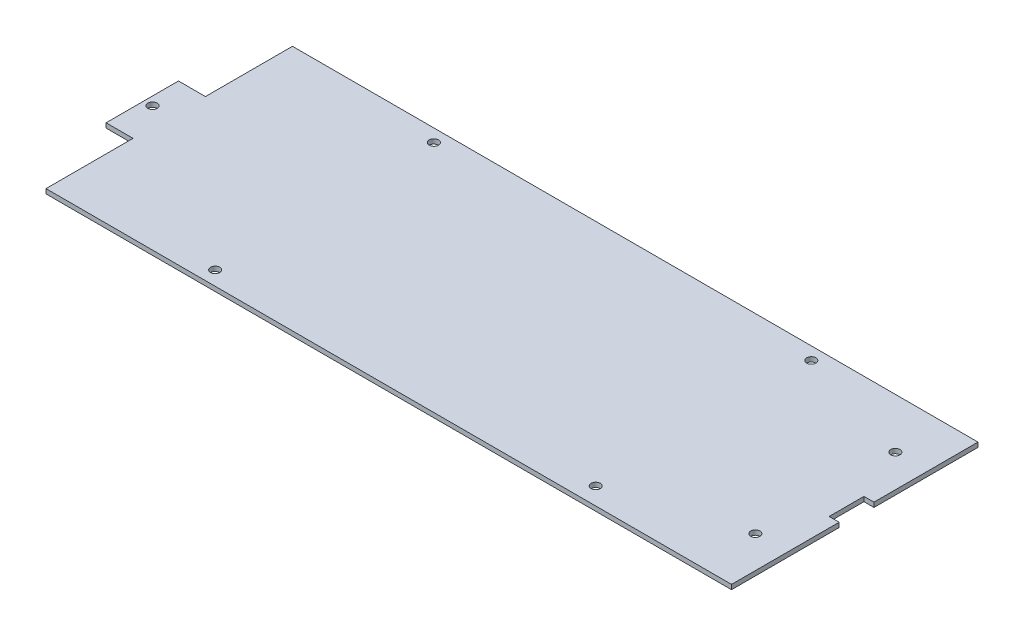
ISO-10303-21;
HEADER;
FILE_DESCRIPTION(('STEP AP214'),'2;1');
FILE_NAME('part.step','',(''),(''),'','','');
FILE_SCHEMA(('AUTOMOTIVE_DESIGN { 1 0 10303 214 1 1 1 1 }'));
ENDSEC;
DATA;
#1=APPLICATION_CONTEXT('core data for automotive mechanical design processes');
#2=APPLICATION_PROTOCOL_DEFINITION('international standard','automotive_design',2000,#1);
#3=PRODUCT_CONTEXT('',#1,'mechanical');
#4=PRODUCT('Part','Part','',(#3));
#5=PRODUCT_RELATED_PRODUCT_CATEGORY('part','',(#4));
#6=PRODUCT_DEFINITION_FORMATION('','',#4);
#7=PRODUCT_DEFINITION_CONTEXT('part definition',#1,'design');
#8=PRODUCT_DEFINITION('design','',#6,#7);
#9=PRODUCT_DEFINITION_SHAPE('','',#8);
#10=(LENGTH_UNIT() NAMED_UNIT(*) SI_UNIT(.MILLI.,.METRE.));
#11=(NAMED_UNIT(*) PLANE_ANGLE_UNIT() SI_UNIT($,.RADIAN.));
#12=(NAMED_UNIT(*) SI_UNIT($,.STERADIAN.) SOLID_ANGLE_UNIT());
#13=UNCERTAINTY_MEASURE_WITH_UNIT(LENGTH_MEASURE(1.E-05),#10,'distance_accuracy_value','');
#14=(GEOMETRIC_REPRESENTATION_CONTEXT(3) GLOBAL_UNCERTAINTY_ASSIGNED_CONTEXT((#13)) GLOBAL_UNIT_ASSIGNED_CONTEXT((#10,
#11,#12)) REPRESENTATION_CONTEXT('',''));
#15=CARTESIAN_POINT('',(0.,0.,0.));
#16=DIRECTION('',(0.,0.,1.));
#17=DIRECTION('',(1.,0.,0.));
#18=AXIS2_PLACEMENT_3D('',#15,#16,#17);
#19=CARTESIAN_POINT('',(2.14373577133293E-13,5.,859.252958265063));
#20=DIRECTION('',(0.,0.,1.));
#21=DIRECTION('',(1.,0.,0.));
#22=AXIS2_PLACEMENT_3D('',#19,#20,#21);
#23=PLANE('',#22);
#24=DIRECTION('',(-1.,0.,0.));
#25=VECTOR('',#24,1.);
#26=CARTESIAN_POINT('',(2.14373577133293E-13,2.,859.252958265063));
#27=LINE('',#26,#25);
#28=CARTESIAN_POINT('',(160.264471064903,2.,859.252958265063));
#29=VERTEX_POINT('',#28);
#30=CARTESIAN_POINT('',(-284.735528935097,2.,859.252958265063));
#31=VERTEX_POINT('',#30);
#32=EDGE_CURVE('E197',#29,#31,#27,.T.);
#33=ORIENTED_EDGE('',*,*,#32,.F.);
#34=DIRECTION('',(0.,-1.,0.));
#35=VECTOR('',#34,1.);
#36=CARTESIAN_POINT('',(160.264471064903,5.,859.252958265063));
#37=LINE('',#36,#35);
#38=CARTESIAN_POINT('',(160.264471064903,5.,859.252958265063));
#39=VERTEX_POINT('',#38);
#40=EDGE_CURVE('E11',#39,#29,#37,.T.);
#41=ORIENTED_EDGE('',*,*,#40,.F.);
#42=DIRECTION('',(-1.,0.,0.));
#43=VECTOR('',#42,1.);
#44=CARTESIAN_POINT('',(2.14373577133293E-13,5.,859.252958265063));
#45=LINE('',#44,#43);
#46=CARTESIAN_POINT('',(-284.735528935097,5.,859.252958265063));
#47=VERTEX_POINT('',#46);
#48=EDGE_CURVE('E542',#39,#47,#45,.T.);
#49=ORIENTED_EDGE('',*,*,#48,.T.);
#50=DIRECTION('',(0.,-1.,0.));
#51=VECTOR('',#50,1.);
#52=CARTESIAN_POINT('',(-284.735528935097,5.,859.252958265063));
#53=LINE('',#52,#51);
#54=EDGE_CURVE('E112',#47,#31,#53,.T.);
#55=ORIENTED_EDGE('',*,*,#54,.T.);
#56=EDGE_LOOP('',(#33,#41,#49,#55));
#57=FACE_BOUND('',#56,.T.);
#58=ADVANCED_FACE('F49',(#57),#23,.T.);
#59=CARTESIAN_POINT('',(160.264471064903,5.,0.));
#60=DIRECTION('',(1.,0.,0.));
#61=DIRECTION('',(0.,0.,-1.));
#62=AXIS2_PLACEMENT_3D('',#59,#60,#61);
#63=PLANE('',#62);
#64=DIRECTION('',(0.,0.,1.));
#65=VECTOR('',#64,1.);
#66=CARTESIAN_POINT('',(160.264471064903,2.,0.));
#67=LINE('',#66,#65);
#68=CARTESIAN_POINT('',(160.264471064903,2.,789.390866852255));
#69=VERTEX_POINT('',#68);
#70=EDGE_CURVE('E195',#69,#29,#67,.T.);
#71=ORIENTED_EDGE('',*,*,#70,.F.);
#72=DIRECTION('',(0.,-1.,0.));
#73=VECTOR('',#72,1.);
#74=CARTESIAN_POINT('',(160.264471064903,5.,789.390866852255));
#75=LINE('',#74,#73);
#76=CARTESIAN_POINT('',(160.264471064903,5.,789.390866852255));
#77=VERTEX_POINT('',#76);
#78=EDGE_CURVE('E58',#77,#69,#75,.T.);
#79=ORIENTED_EDGE('',*,*,#78,.F.);
#80=DIRECTION('',(0.,0.,1.));
#81=VECTOR('',#80,1.);
#82=CARTESIAN_POINT('',(160.264471064903,5.,0.));
#83=LINE('',#82,#81);
#84=EDGE_CURVE('E540',#77,#39,#83,.T.);
#85=ORIENTED_EDGE('',*,*,#84,.T.);
#86=ORIENTED_EDGE('',*,*,#40,.T.);
#87=EDGE_LOOP('',(#71,#79,#85,#86));
#88=FACE_BOUND('',#87,.T.);
#89=ADVANCED_FACE('F196',(#88),#63,.T.);
#90=CARTESIAN_POINT('',(0.,5.,789.390866852255));
#91=DIRECTION('',(0.,0.,-1.));
#92=DIRECTION('',(-1.,0.,0.));
#93=AXIS2_PLACEMENT_3D('',#90,#91,#92);
#94=PLANE('',#93);
#95=DIRECTION('',(1.,0.,0.));
#96=VECTOR('',#95,1.);
#97=CARTESIAN_POINT('',(0.,2.,789.390866852255));
#98=LINE('',#97,#96);
#99=CARTESIAN_POINT('',(153.764471064903,2.,789.390866852255));
#100=VERTEX_POINT('',#99);
#101=EDGE_CURVE('E187',#100,#69,#98,.T.);
#102=ORIENTED_EDGE('',*,*,#101,.F.);
#103=DIRECTION('',(0.,-1.,0.));
#104=VECTOR('',#103,1.);
#105=CARTESIAN_POINT('',(153.764471064903,5.,789.390866852255));
#106=LINE('',#105,#104);
#107=CARTESIAN_POINT('',(153.764471064903,5.,789.390866852255));
#108=VERTEX_POINT('',#107);
#109=EDGE_CURVE('E180',#108,#100,#106,.T.);
#110=ORIENTED_EDGE('',*,*,#109,.F.);
#111=DIRECTION('',(1.,0.,0.));
#112=VECTOR('',#111,1.);
#113=CARTESIAN_POINT('',(0.,5.,789.390866852255));
#114=LINE('',#113,#112);
#115=EDGE_CURVE('E190',#108,#77,#114,.T.);
#116=ORIENTED_EDGE('',*,*,#115,.T.);
#117=ORIENTED_EDGE('',*,*,#78,.T.);
#118=EDGE_LOOP('',(#102,#110,#116,#117));
#119=FACE_BOUND('',#118,.T.);
#120=ADVANCED_FACE('F185',(#119),#94,.T.);
#121=CARTESIAN_POINT('',(153.764471064903,5.,0.));
#122=DIRECTION('',(1.,0.,0.));
#123=DIRECTION('',(0.,0.,-1.));
#124=AXIS2_PLACEMENT_3D('',#121,#122,#123);
#125=PLANE('',#124);
#126=DIRECTION('',(0.,0.,1.));
#127=VECTOR('',#126,1.);
#128=CARTESIAN_POINT('',(153.764471064903,2.,0.));
#129=LINE('',#128,#127);
#130=CARTESIAN_POINT('',(153.764471064903,2.,766.790866852254));
#131=VERTEX_POINT('',#130);
#132=EDGE_CURVE('E203',#131,#100,#129,.T.);
#133=ORIENTED_EDGE('',*,*,#132,.F.);
#134=DIRECTION('',(0.,-1.,0.));
#135=VECTOR('',#134,1.);
#136=CARTESIAN_POINT('',(153.764471064903,5.,766.790866852254));
#137=LINE('',#136,#135);
#138=CARTESIAN_POINT('',(153.764471064903,5.,766.790866852254));
#139=VERTEX_POINT('',#138);
#140=EDGE_CURVE('E178',#139,#131,#137,.T.);
#141=ORIENTED_EDGE('',*,*,#140,.F.);
#142=DIRECTION('',(0.,0.,1.));
#143=VECTOR('',#142,1.);
#144=CARTESIAN_POINT('',(153.764471064903,5.,0.));
#145=LINE('',#144,#143);
#146=EDGE_CURVE('E493',#139,#108,#145,.T.);
#147=ORIENTED_EDGE('',*,*,#146,.T.);
#148=ORIENTED_EDGE('',*,*,#109,.T.);
#149=EDGE_LOOP('',(#133,#141,#147,#148));
#150=FACE_BOUND('',#149,.T.);
#151=ADVANCED_FACE('F333',(#150),#125,.T.);
#152=CARTESIAN_POINT('',(0.,5.,766.790866852254));
#153=DIRECTION('',(0.,0.,1.));
#154=DIRECTION('',(1.,0.,0.));
#155=AXIS2_PLACEMENT_3D('',#152,#153,#154);
#156=PLANE('',#155);
#157=DIRECTION('',(-1.,0.,0.));
#158=VECTOR('',#157,1.);
#159=CARTESIAN_POINT('',(0.,2.,766.790866852254));
#160=LINE('',#159,#158);
#161=CARTESIAN_POINT('',(160.264471064903,2.,766.790866852254));
#162=VERTEX_POINT('',#161);
#163=EDGE_CURVE('E205',#162,#131,#160,.T.);
#164=ORIENTED_EDGE('',*,*,#163,.F.);
#165=DIRECTION('',(0.,-1.,0.));
#166=VECTOR('',#165,1.);
#167=CARTESIAN_POINT('',(160.264471064903,5.,766.790866852254));
#168=LINE('',#167,#166);
#169=CARTESIAN_POINT('',(160.264471064903,5.,766.790866852254));
#170=VERTEX_POINT('',#169);
#171=EDGE_CURVE('E176',#170,#162,#168,.T.);
#172=ORIENTED_EDGE('',*,*,#171,.F.);
#173=DIRECTION('',(-1.,0.,0.));
#174=VECTOR('',#173,1.);
#175=CARTESIAN_POINT('',(0.,5.,766.790866852254));
#176=LINE('',#175,#174);
#177=EDGE_CURVE('E489',#170,#139,#176,.T.);
#178=ORIENTED_EDGE('',*,*,#177,.T.);
#179=ORIENTED_EDGE('',*,*,#140,.T.);
#180=EDGE_LOOP('',(#164,#172,#178,#179));
#181=FACE_BOUND('',#180,.T.);
#182=ADVANCED_FACE('F329',(#181),#156,.T.);
#183=CARTESIAN_POINT('',(160.264471064903,5.,0.));
#184=DIRECTION('',(1.,0.,0.));
#185=DIRECTION('',(0.,0.,-1.));
#186=AXIS2_PLACEMENT_3D('',#183,#184,#185);
#187=PLANE('',#186);
#188=DIRECTION('',(0.,0.,1.));
#189=VECTOR('',#188,1.);
#190=CARTESIAN_POINT('',(160.264471064903,2.,0.));
#191=LINE('',#190,#189);
#192=CARTESIAN_POINT('',(160.264471064903,2.,699.252958265063));
#193=VERTEX_POINT('',#192);
#194=EDGE_CURVE('E210',#193,#162,#191,.T.);
#195=ORIENTED_EDGE('',*,*,#194,.F.);
#196=DIRECTION('',(0.,-1.,0.));
#197=VECTOR('',#196,1.);
#198=CARTESIAN_POINT('',(160.264471064903,5.,699.252958265063));
#199=LINE('',#198,#197);
#200=CARTESIAN_POINT('',(160.264471064903,5.,699.252958265063));
#201=VERTEX_POINT('',#200);
#202=EDGE_CURVE('E174',#201,#193,#199,.T.);
#203=ORIENTED_EDGE('',*,*,#202,.F.);
#204=DIRECTION('',(0.,0.,1.));
#205=VECTOR('',#204,1.);
#206=CARTESIAN_POINT('',(160.264471064903,5.,0.));
#207=LINE('',#206,#205);
#208=EDGE_CURVE('E492',#201,#170,#207,.T.);
#209=ORIENTED_EDGE('',*,*,#208,.T.);
#210=ORIENTED_EDGE('',*,*,#171,.T.);
#211=EDGE_LOOP('',(#195,#203,#209,#210));
#212=FACE_BOUND('',#211,.T.);
#213=ADVANCED_FACE('F325',(#212),#187,.T.);
#214=CARTESIAN_POINT('',(-1.74455445910815E-13,5.,699.252958265063));
#215=DIRECTION('',(0.,0.,-1.));
#216=DIRECTION('',(-1.,0.,0.));
#217=AXIS2_PLACEMENT_3D('',#214,#215,#216);
#218=PLANE('',#217);
#219=DIRECTION('',(1.,0.,0.));
#220=VECTOR('',#219,1.);
#221=CARTESIAN_POINT('',(-1.74455445910815E-13,2.,699.252958265063));
#222=LINE('',#221,#220);
#223=CARTESIAN_POINT('',(-284.735528935097,2.,699.252958265063));
#224=VERTEX_POINT('',#223);
#225=EDGE_CURVE('E213',#224,#193,#222,.T.);
#226=ORIENTED_EDGE('',*,*,#225,.F.);
#227=DIRECTION('',(0.,-1.,0.));
#228=VECTOR('',#227,1.);
#229=CARTESIAN_POINT('',(-284.735528935097,5.,699.252958265063));
#230=LINE('',#229,#228);
#231=CARTESIAN_POINT('',(-284.735528935097,5.,699.252958265063));
#232=VERTEX_POINT('',#231);
#233=EDGE_CURVE('E172',#232,#224,#230,.T.);
#234=ORIENTED_EDGE('',*,*,#233,.F.);
#235=DIRECTION('',(1.,0.,0.));
#236=VECTOR('',#235,1.);
#237=CARTESIAN_POINT('',(-1.74455445910815E-13,5.,699.252958265063));
#238=LINE('',#237,#236);
#239=EDGE_CURVE('E495',#232,#201,#238,.T.);
#240=ORIENTED_EDGE('',*,*,#239,.T.);
#241=ORIENTED_EDGE('',*,*,#202,.T.);
#242=EDGE_LOOP('',(#226,#234,#240,#241));
#243=FACE_BOUND('',#242,.T.);
#244=ADVANCED_FACE('F321',(#243),#218,.T.);
#245=CARTESIAN_POINT('',(-284.735528935097,5.,2.79752159427051E-13));
#246=DIRECTION('',(1.,0.,0.));
#247=DIRECTION('',(0.,0.,-1.));
#248=AXIS2_PLACEMENT_3D('',#245,#246,#247);
#249=PLANE('',#248);
#250=DIRECTION('',(0.,0.,1.));
#251=VECTOR('',#250,1.);
#252=CARTESIAN_POINT('',(-284.735528935097,2.,2.79752159427051E-13));
#253=LINE('',#252,#251);
#254=CARTESIAN_POINT('',(-284.735528935097,2.,755.752958265063));
#255=VERTEX_POINT('',#254);
#256=EDGE_CURVE('E216',#224,#255,#253,.T.);
#257=ORIENTED_EDGE('',*,*,#256,.T.);
#258=DIRECTION('',(0.,-1.,0.));
#259=VECTOR('',#258,1.);
#260=CARTESIAN_POINT('',(-284.735528935097,5.,755.752958265063));
#261=LINE('',#260,#259);
#262=CARTESIAN_POINT('',(-284.735528935097,5.,755.752958265063));
#263=VERTEX_POINT('',#262);
#264=EDGE_CURVE('E166',#263,#255,#261,.T.);
#265=ORIENTED_EDGE('',*,*,#264,.F.);
#266=DIRECTION('',(0.,0.,1.));
#267=VECTOR('',#266,1.);
#268=CARTESIAN_POINT('',(-284.735528935097,5.,2.79752159427051E-13));
#269=LINE('',#268,#267);
#270=EDGE_CURVE('E502',#232,#263,#269,.T.);
#271=ORIENTED_EDGE('',*,*,#270,.F.);
#272=ORIENTED_EDGE('',*,*,#233,.T.);
#273=EDGE_LOOP('',(#257,#265,#271,#272));
#274=FACE_BOUND('',#273,.T.);
#275=ADVANCED_FACE('F317',(#274),#249,.F.);
#276=CARTESIAN_POINT('',(0.,5.,755.752958265063));
#277=DIRECTION('',(0.,0.,-1.));
#278=DIRECTION('',(-1.,0.,0.));
#279=AXIS2_PLACEMENT_3D('',#276,#277,#278);
#280=PLANE('',#279);
#281=DIRECTION('',(1.,0.,0.));
#282=VECTOR('',#281,1.);
#283=CARTESIAN_POINT('',(0.,2.,755.752958265063));
#284=LINE('',#283,#282);
#285=CARTESIAN_POINT('',(-302.235528935097,2.,755.752958265063));
#286=VERTEX_POINT('',#285);
#287=EDGE_CURVE('E219',#286,#255,#284,.T.);
#288=ORIENTED_EDGE('',*,*,#287,.F.);
#289=DIRECTION('',(0.,-1.,0.));
#290=VECTOR('',#289,1.);
#291=CARTESIAN_POINT('',(-302.235528935097,5.,755.752958265063));
#292=LINE('',#291,#290);
#293=CARTESIAN_POINT('',(-302.235528935097,5.,755.752958265063));
#294=VERTEX_POINT('',#293);
#295=EDGE_CURVE('E164',#294,#286,#292,.T.);
#296=ORIENTED_EDGE('',*,*,#295,.F.);
#297=DIRECTION('',(1.,0.,0.));
#298=VECTOR('',#297,1.);
#299=CARTESIAN_POINT('',(0.,5.,755.752958265063));
#300=LINE('',#299,#298);
#301=EDGE_CURVE('E158',#294,#263,#300,.T.);
#302=ORIENTED_EDGE('',*,*,#301,.T.);
#303=ORIENTED_EDGE('',*,*,#264,.T.);
#304=EDGE_LOOP('',(#288,#296,#302,#303));
#305=FACE_BOUND('',#304,.T.);
#306=ADVANCED_FACE('F314',(#305),#280,.T.);
#307=CARTESIAN_POINT('',(-302.235528935097,5.,0.));
#308=DIRECTION('',(1.,0.,0.));
#309=DIRECTION('',(0.,0.,-1.));
#310=AXIS2_PLACEMENT_3D('',#307,#308,#309);
#311=PLANE('',#310);
#312=DIRECTION('',(0.,0.,1.));
#313=VECTOR('',#312,1.);
#314=CARTESIAN_POINT('',(-302.235528935097,2.,0.));
#315=LINE('',#314,#313);
#316=CARTESIAN_POINT('',(-302.235528935097,2.,802.752958265064));
#317=VERTEX_POINT('',#316);
#318=EDGE_CURVE('E163',#286,#317,#315,.T.);
#319=ORIENTED_EDGE('',*,*,#318,.T.);
#320=DIRECTION('',(0.,-1.,0.));
#321=VECTOR('',#320,1.);
#322=CARTESIAN_POINT('',(-302.235528935097,5.,802.752958265064));
#323=LINE('',#322,#321);
#324=CARTESIAN_POINT('',(-302.235528935097,5.,802.752958265064));
#325=VERTEX_POINT('',#324);
#326=EDGE_CURVE('E148',#325,#317,#323,.T.);
#327=ORIENTED_EDGE('',*,*,#326,.F.);
#328=DIRECTION('',(0.,0.,1.));
#329=VECTOR('',#328,1.);
#330=CARTESIAN_POINT('',(-302.235528935097,5.,0.));
#331=LINE('',#330,#329);
#332=EDGE_CURVE('E151',#294,#325,#331,.T.);
#333=ORIENTED_EDGE('',*,*,#332,.F.);
#334=ORIENTED_EDGE('',*,*,#295,.T.);
#335=EDGE_LOOP('',(#319,#327,#333,#334));
#336=FACE_BOUND('',#335,.T.);
#337=ADVANCED_FACE('F161',(#336),#311,.F.);
#338=CARTESIAN_POINT('',(5.09277038486759E-12,5.,802.752958265062));
#339=DIRECTION('',(0.,0.,-1.));
#340=DIRECTION('',(-1.,0.,0.));
#341=AXIS2_PLACEMENT_3D('',#338,#339,#340);
#342=PLANE('',#341);
#343=DIRECTION('',(1.,0.,0.));
#344=VECTOR('',#343,1.);
#345=CARTESIAN_POINT('',(5.09277038486759E-12,2.,802.752958265062));
#346=LINE('',#345,#344);
#347=CARTESIAN_POINT('',(-284.735528935097,2.,802.752958265063));
#348=VERTEX_POINT('',#347);
#349=EDGE_CURVE('E223',#317,#348,#346,.T.);
#350=ORIENTED_EDGE('',*,*,#349,.T.);
#351=DIRECTION('',(0.,-1.,0.));
#352=VECTOR('',#351,1.);
#353=CARTESIAN_POINT('',(-284.735528935097,5.,802.752958265063));
#354=LINE('',#353,#352);
#355=CARTESIAN_POINT('',(-284.735528935097,5.,802.752958265063));
#356=VERTEX_POINT('',#355);
#357=EDGE_CURVE('E150',#356,#348,#354,.T.);
#358=ORIENTED_EDGE('',*,*,#357,.F.);
#359=DIRECTION('',(1.,0.,0.));
#360=VECTOR('',#359,1.);
#361=CARTESIAN_POINT('',(5.09277038486759E-12,5.,802.752958265062));
#362=LINE('',#361,#360);
#363=EDGE_CURVE('E143',#325,#356,#362,.T.);
#364=ORIENTED_EDGE('',*,*,#363,.F.);
#365=ORIENTED_EDGE('',*,*,#326,.T.);
#366=EDGE_LOOP('',(#350,#358,#364,#365));
#367=FACE_BOUND('',#366,.T.);
#368=ADVANCED_FACE('F146',(#367),#342,.F.);
#369=CARTESIAN_POINT('',(60.8561647841926,5.,847.989637053731));
#370=DIRECTION('',(0.,-1.,0.));
#371=DIRECTION('',(0.,0.,-1.));
#372=AXIS2_PLACEMENT_3D('',#369,#370,#371);
#373=CYLINDRICAL_SURFACE('',#372,2.99999999999995);
#374=CARTESIAN_POINT('',(60.8561647841926,5.,847.989637053731));
#375=DIRECTION('',(0.,1.,0.));
#376=DIRECTION('',(0.,0.,1.));
#377=AXIS2_PLACEMENT_3D('',#374,#375,#376);
#378=CIRCLE('',#377,2.99999999999995);
#379=CARTESIAN_POINT('',(60.8561647841926,5.,850.989637053731));
#380=VERTEX_POINT('',#379);
#381=EDGE_CURVE('E243',#380,#380,#378,.T.);
#382=ORIENTED_EDGE('',*,*,#381,.T.);
#383=EDGE_LOOP('',(#382));
#384=FACE_BOUND('',#383,.T.);
#385=CARTESIAN_POINT('',(60.8561647841926,2.,847.989637053731));
#386=DIRECTION('',(0.,1.,0.));
#387=DIRECTION('',(0.,0.,1.));
#388=AXIS2_PLACEMENT_3D('',#385,#386,#387);
#389=CIRCLE('',#388,2.99999999999995);
#390=CARTESIAN_POINT('',(60.8561647841926,2.,850.989637053731));
#391=VERTEX_POINT('',#390);
#392=EDGE_CURVE('E235',#391,#391,#389,.T.);
#393=ORIENTED_EDGE('',*,*,#392,.F.);
#394=EDGE_LOOP('',(#393));
#395=FACE_BOUND('',#394,.T.);
#396=ADVANCED_FACE('F295',(#384,#395),#373,.F.);
#397=CARTESIAN_POINT('',(139.486711965203,5.,823.034841954363));
#398=DIRECTION('',(0.,-1.,0.));
#399=DIRECTION('',(0.,0.,-1.));
#400=AXIS2_PLACEMENT_3D('',#397,#398,#399);
#401=CYLINDRICAL_SURFACE('',#400,2.99999999999992);
#402=CARTESIAN_POINT('',(139.486711965203,5.,823.034841954363));
#403=DIRECTION('',(0.,1.,0.));
#404=DIRECTION('',(0.,0.,1.));
#405=AXIS2_PLACEMENT_3D('',#402,#403,#404);
#406=CIRCLE('',#405,2.99999999999992);
#407=CARTESIAN_POINT('',(139.486711965203,5.,826.034841954363));
#408=VERTEX_POINT('',#407);
#409=EDGE_CURVE('E248',#408,#408,#406,.F.);
#410=ORIENTED_EDGE('',*,*,#409,.F.);
#411=EDGE_LOOP('',(#410));
#412=FACE_BOUND('',#411,.T.);
#413=CARTESIAN_POINT('',(139.486711965203,2.,823.034841954363));
#414=DIRECTION('',(0.,1.,0.));
#415=DIRECTION('',(0.,0.,1.));
#416=AXIS2_PLACEMENT_3D('',#413,#414,#415);
#417=CIRCLE('',#416,2.99999999999992);
#418=CARTESIAN_POINT('',(139.486711965203,2.,826.034841954363));
#419=VERTEX_POINT('',#418);
#420=EDGE_CURVE('E232',#419,#419,#417,.F.);
#421=ORIENTED_EDGE('',*,*,#420,.T.);
#422=EDGE_LOOP('',(#421));
#423=FACE_BOUND('',#422,.T.);
#424=ADVANCED_FACE('F298',(#412,#423),#401,.F.);
#425=CARTESIAN_POINT('',(139.102370463273,5.,731.752958265063));
#426=DIRECTION('',(0.,-1.,0.));
#427=DIRECTION('',(0.,0.,-1.));
#428=AXIS2_PLACEMENT_3D('',#425,#426,#427);
#429=CYLINDRICAL_SURFACE('',#428,3.00000000364041);
#430=CARTESIAN_POINT('',(139.102370463273,5.,731.752958265063));
#431=DIRECTION('',(0.,1.,0.));
#432=DIRECTION('',(0.,0.,1.));
#433=AXIS2_PLACEMENT_3D('',#430,#431,#432);
#434=CIRCLE('',#433,3.00000000364041);
#435=CARTESIAN_POINT('',(139.102370463273,5.,734.752958268704));
#436=VERTEX_POINT('',#435);
#437=EDGE_CURVE('E509',#436,#436,#434,.T.);
#438=ORIENTED_EDGE('',*,*,#437,.T.);
#439=EDGE_LOOP('',(#438));
#440=FACE_BOUND('',#439,.T.);
#441=CARTESIAN_POINT('',(139.102370463273,2.,731.752958265063));
#442=DIRECTION('',(0.,1.,0.));
#443=DIRECTION('',(0.,0.,1.));
#444=AXIS2_PLACEMENT_3D('',#441,#442,#443);
#445=CIRCLE('',#444,3.00000000364041);
#446=CARTESIAN_POINT('',(139.102370463273,2.,734.752958268704));
#447=VERTEX_POINT('',#446);
#448=EDGE_CURVE('E229',#447,#447,#445,.T.);
#449=ORIENTED_EDGE('',*,*,#448,.F.);
#450=EDGE_LOOP('',(#449));
#451=FACE_BOUND('',#450,.T.);
#452=ADVANCED_FACE('F302',(#440,#451),#429,.F.);
#453=CARTESIAN_POINT('',(-296.746466160469,5.,778.090866839792));
#454=DIRECTION('',(0.,-1.,0.));
#455=DIRECTION('',(0.,0.,-1.));
#456=AXIS2_PLACEMENT_3D('',#453,#454,#455);
#457=CYLINDRICAL_SURFACE('',#456,2.99999999998961);
#458=CARTESIAN_POINT('',(-296.746466160469,5.,778.090866839792));
#459=DIRECTION('',(0.,1.,0.));
#460=DIRECTION('',(0.,0.,1.));
#461=AXIS2_PLACEMENT_3D('',#458,#459,#460);
#462=CIRCLE('',#461,2.99999999998961);
#463=CARTESIAN_POINT('',(-296.746466160469,5.,781.090866839781));
#464=VERTEX_POINT('',#463);
#465=EDGE_CURVE('E506',#464,#464,#462,.T.);
#466=ORIENTED_EDGE('',*,*,#465,.T.);
#467=EDGE_LOOP('',(#466));
#468=FACE_BOUND('',#467,.T.);
#469=CARTESIAN_POINT('',(-296.746466160469,2.,778.090866839792));
#470=DIRECTION('',(0.,1.,0.));
#471=DIRECTION('',(0.,0.,1.));
#472=AXIS2_PLACEMENT_3D('',#469,#470,#471);
#473=CIRCLE('',#472,2.99999999998961);
#474=CARTESIAN_POINT('',(-296.746466160469,2.,781.090866839781));
#475=VERTEX_POINT('',#474);
#476=EDGE_CURVE('E226',#475,#475,#473,.T.);
#477=ORIENTED_EDGE('',*,*,#476,.F.);
#478=EDGE_LOOP('',(#477));
#479=FACE_BOUND('',#478,.T.);
#480=ADVANCED_FACE('F274',(#468,#479),#457,.F.);
#481=CARTESIAN_POINT('',(-284.735528935097,5.,0.));
#482=DIRECTION('',(1.,0.,0.));
#483=DIRECTION('',(0.,0.,-1.));
#484=AXIS2_PLACEMENT_3D('',#481,#482,#483);
#485=PLANE('',#484);
#486=DIRECTION('',(0.,0.,1.));
#487=VECTOR('',#486,1.);
#488=CARTESIAN_POINT('',(-284.735528935097,2.,0.));
#489=LINE('',#488,#487);
#490=EDGE_CURVE('E105',#348,#31,#489,.T.);
#491=ORIENTED_EDGE('',*,*,#490,.T.);
#492=ORIENTED_EDGE('',*,*,#54,.F.);
#493=DIRECTION('',(0.,0.,1.));
#494=VECTOR('',#493,1.);
#495=CARTESIAN_POINT('',(-284.735528935097,5.,0.));
#496=LINE('',#495,#494);
#497=EDGE_CURVE('E66',#356,#47,#496,.T.);
#498=ORIENTED_EDGE('',*,*,#497,.F.);
#499=ORIENTED_EDGE('',*,*,#357,.T.);
#500=EDGE_LOOP('',(#491,#492,#498,#499));
#501=FACE_BOUND('',#500,.T.);
#502=ADVANCED_FACE('F266',(#501),#485,.F.);
#503=CARTESIAN_POINT('',(-184.735528935097,5.,707.46118256033));
#504=DIRECTION('',(0.,-1.,0.));
#505=DIRECTION('',(0.,0.,-1.));
#506=AXIS2_PLACEMENT_3D('',#503,#504,#505);
#507=CYLINDRICAL_SURFACE('',#506,3.00000000364036);
#508=CARTESIAN_POINT('',(-184.735528935097,5.,707.46118256033));
#509=DIRECTION('',(0.,1.,0.));
#510=DIRECTION('',(0.,0.,1.));
#511=AXIS2_PLACEMENT_3D('',#508,#509,#510);
#512=CIRCLE('',#511,3.00000000364036);
#513=CARTESIAN_POINT('',(-184.735528935097,5.,710.461182563971));
#514=VERTEX_POINT('',#513);
#515=EDGE_CURVE('E280',#514,#514,#512,.T.);
#516=ORIENTED_EDGE('',*,*,#515,.T.);
#517=EDGE_LOOP('',(#516));
#518=FACE_BOUND('',#517,.T.);
#519=CARTESIAN_POINT('',(-184.735528935097,2.,707.46118256033));
#520=DIRECTION('',(0.,1.,0.));
#521=DIRECTION('',(0.,0.,1.));
#522=AXIS2_PLACEMENT_3D('',#519,#520,#521);
#523=CIRCLE('',#522,3.00000000364036);
#524=CARTESIAN_POINT('',(-184.735528935097,2.,710.461182563971));
#525=VERTEX_POINT('',#524);
#526=EDGE_CURVE('E255',#525,#525,#523,.T.);
#527=ORIENTED_EDGE('',*,*,#526,.F.);
#528=EDGE_LOOP('',(#527));
#529=FACE_BOUND('',#528,.T.);
#530=ADVANCED_FACE('F264',(#518,#529),#507,.F.);
#531=CARTESIAN_POINT('',(60.2644710649034,5.,707.46118256033));
#532=DIRECTION('',(0.,-1.,0.));
#533=DIRECTION('',(0.,0.,-1.));
#534=AXIS2_PLACEMENT_3D('',#531,#532,#533);
#535=CYLINDRICAL_SURFACE('',#534,3.00000000364036);
#536=CARTESIAN_POINT('',(60.2644710649034,5.,707.46118256033));
#537=DIRECTION('',(0.,1.,0.));
#538=DIRECTION('',(0.,0.,1.));
#539=AXIS2_PLACEMENT_3D('',#536,#537,#538);
#540=CIRCLE('',#539,3.00000000364036);
#541=CARTESIAN_POINT('',(60.2644710649034,5.,710.461182563971));
#542=VERTEX_POINT('',#541);
#543=EDGE_CURVE('E240',#542,#542,#540,.F.);
#544=ORIENTED_EDGE('',*,*,#543,.F.);
#545=EDGE_LOOP('',(#544));
#546=FACE_BOUND('',#545,.T.);
#547=CARTESIAN_POINT('',(60.2644710649034,2.,707.46118256033));
#548=DIRECTION('',(0.,1.,0.));
#549=DIRECTION('',(0.,0.,1.));
#550=AXIS2_PLACEMENT_3D('',#547,#548,#549);
#551=CIRCLE('',#550,3.00000000364036);
#552=CARTESIAN_POINT('',(60.2644710649034,2.,710.461182563971));
#553=VERTEX_POINT('',#552);
#554=EDGE_CURVE('E252',#553,#553,#551,.F.);
#555=ORIENTED_EDGE('',*,*,#554,.T.);
#556=EDGE_LOOP('',(#555));
#557=FACE_BOUND('',#556,.T.);
#558=ADVANCED_FACE('F51',(#546,#557),#535,.F.);
#559=CARTESIAN_POINT('',(-184.135148537082,5.,850.052740811925));
#560=DIRECTION('',(0.,-1.,0.));
#561=DIRECTION('',(0.,0.,-1.));
#562=AXIS2_PLACEMENT_3D('',#559,#560,#561);
#563=CYLINDRICAL_SURFACE('',#562,2.99999999335644);
#564=CARTESIAN_POINT('',(-184.135148537082,5.,850.052740811925));
#565=DIRECTION('',(0.,1.,0.));
#566=DIRECTION('',(0.,0.,1.));
#567=AXIS2_PLACEMENT_3D('',#564,#565,#566);
#568=CIRCLE('',#567,2.99999999335644);
#569=CARTESIAN_POINT('',(-184.135148537082,5.,853.052740805282));
#570=VERTEX_POINT('',#569);
#571=EDGE_CURVE('E241',#570,#570,#568,.F.);
#572=ORIENTED_EDGE('',*,*,#571,.F.);
#573=EDGE_LOOP('',(#572));
#574=FACE_BOUND('',#573,.T.);
#575=CARTESIAN_POINT('',(-184.135148537082,2.,850.052740811925));
#576=DIRECTION('',(0.,1.,0.));
#577=DIRECTION('',(0.,0.,1.));
#578=AXIS2_PLACEMENT_3D('',#575,#576,#577);
#579=CIRCLE('',#578,2.99999999335644);
#580=CARTESIAN_POINT('',(-184.135148537082,2.,853.052740805282));
#581=VERTEX_POINT('',#580);
#582=EDGE_CURVE('E238',#581,#581,#579,.F.);
#583=ORIENTED_EDGE('',*,*,#582,.T.);
#584=EDGE_LOOP('',(#583));
#585=FACE_BOUND('',#584,.T.);
#586=ADVANCED_FACE('F272',(#574,#585),#563,.F.);
#587=CARTESIAN_POINT('',(0.,5.,0.));
#588=DIRECTION('',(0.,1.,0.));
#589=DIRECTION('',(0.,0.,1.));
#590=AXIS2_PLACEMENT_3D('',#587,#588,#589);
#591=PLANE('',#590);
#592=ORIENTED_EDGE('',*,*,#543,.T.);
#593=EDGE_LOOP('',(#592));
#594=FACE_BOUND('',#593,.T.);
#595=ORIENTED_EDGE('',*,*,#515,.F.);
#596=EDGE_LOOP('',(#595));
#597=FACE_BOUND('',#596,.T.);
#598=ORIENTED_EDGE('',*,*,#48,.F.);
#599=ORIENTED_EDGE('',*,*,#84,.F.);
#600=ORIENTED_EDGE('',*,*,#115,.F.);
#601=ORIENTED_EDGE('',*,*,#146,.F.);
#602=ORIENTED_EDGE('',*,*,#177,.F.);
#603=ORIENTED_EDGE('',*,*,#208,.F.);
#604=ORIENTED_EDGE('',*,*,#239,.F.);
#605=ORIENTED_EDGE('',*,*,#270,.T.);
#606=ORIENTED_EDGE('',*,*,#301,.F.);
#607=ORIENTED_EDGE('',*,*,#332,.T.);
#608=ORIENTED_EDGE('',*,*,#363,.T.);
#609=ORIENTED_EDGE('',*,*,#497,.T.);
#610=EDGE_LOOP('',(#598,#599,#600,#601,#602,#603,#604,#605,#606,#607,#608,#609));
#611=FACE_BOUND('',#610,.T.);
#612=ORIENTED_EDGE('',*,*,#465,.F.);
#613=EDGE_LOOP('',(#612));
#614=FACE_BOUND('',#613,.T.);
#615=ORIENTED_EDGE('',*,*,#437,.F.);
#616=EDGE_LOOP('',(#615));
#617=FACE_BOUND('',#616,.T.);
#618=ORIENTED_EDGE('',*,*,#409,.T.);
#619=EDGE_LOOP('',(#618));
#620=FACE_BOUND('',#619,.T.);
#621=ORIENTED_EDGE('',*,*,#381,.F.);
#622=EDGE_LOOP('',(#621));
#623=FACE_BOUND('',#622,.T.);
#624=ORIENTED_EDGE('',*,*,#571,.T.);
#625=EDGE_LOOP('',(#624));
#626=FACE_BOUND('',#625,.T.);
#627=ADVANCED_FACE('F155',(#594,#597,#611,#614,#617,#620,#623,#626),#591,.T.);
#628=CARTESIAN_POINT('',(0.,2.,0.));
#629=DIRECTION('',(0.,1.,0.));
#630=DIRECTION('',(0.,0.,1.));
#631=AXIS2_PLACEMENT_3D('',#628,#629,#630);
#632=PLANE('',#631);
#633=ORIENTED_EDGE('',*,*,#554,.F.);
#634=EDGE_LOOP('',(#633));
#635=FACE_BOUND('',#634,.T.);
#636=ORIENTED_EDGE('',*,*,#526,.T.);
#637=EDGE_LOOP('',(#636));
#638=FACE_BOUND('',#637,.T.);
#639=ORIENTED_EDGE('',*,*,#32,.T.);
#640=ORIENTED_EDGE('',*,*,#490,.F.);
#641=ORIENTED_EDGE('',*,*,#349,.F.);
#642=ORIENTED_EDGE('',*,*,#318,.F.);
#643=ORIENTED_EDGE('',*,*,#287,.T.);
#644=ORIENTED_EDGE('',*,*,#256,.F.);
#645=ORIENTED_EDGE('',*,*,#225,.T.);
#646=ORIENTED_EDGE('',*,*,#194,.T.);
#647=ORIENTED_EDGE('',*,*,#163,.T.);
#648=ORIENTED_EDGE('',*,*,#132,.T.);
#649=ORIENTED_EDGE('',*,*,#101,.T.);
#650=ORIENTED_EDGE('',*,*,#70,.T.);
#651=EDGE_LOOP('',(#639,#640,#641,#642,#643,#644,#645,#646,#647,#648,#649,#650));
#652=FACE_BOUND('',#651,.T.);
#653=ORIENTED_EDGE('',*,*,#476,.T.);
#654=EDGE_LOOP('',(#653));
#655=FACE_BOUND('',#654,.T.);
#656=ORIENTED_EDGE('',*,*,#448,.T.);
#657=EDGE_LOOP('',(#656));
#658=FACE_BOUND('',#657,.T.);
#659=ORIENTED_EDGE('',*,*,#420,.F.);
#660=EDGE_LOOP('',(#659));
#661=FACE_BOUND('',#660,.T.);
#662=ORIENTED_EDGE('',*,*,#392,.T.);
#663=EDGE_LOOP('',(#662));
#664=FACE_BOUND('',#663,.T.);
#665=ORIENTED_EDGE('',*,*,#582,.F.);
#666=EDGE_LOOP('',(#665));
#667=FACE_BOUND('',#666,.T.);
#668=ADVANCED_FACE('F199',(#635,#638,#652,#655,#658,#661,#664,#667),#632,.F.);
#669=CLOSED_SHELL('',(#58,#89,#120,#151,#182,#213,#244,#275,#306,#337,#368,#396,#424,#452,#480,
#502,#530,#558,#586,#627,#668));
#670=MANIFOLD_SOLID_BREP('B2',#669);
#671=ADVANCED_BREP_SHAPE_REPRESENTATION('',(#18,#670),#14);
#672=SHAPE_DEFINITION_REPRESENTATION(#9,#671);
ENDSEC;
END-ISO-10303-21;
